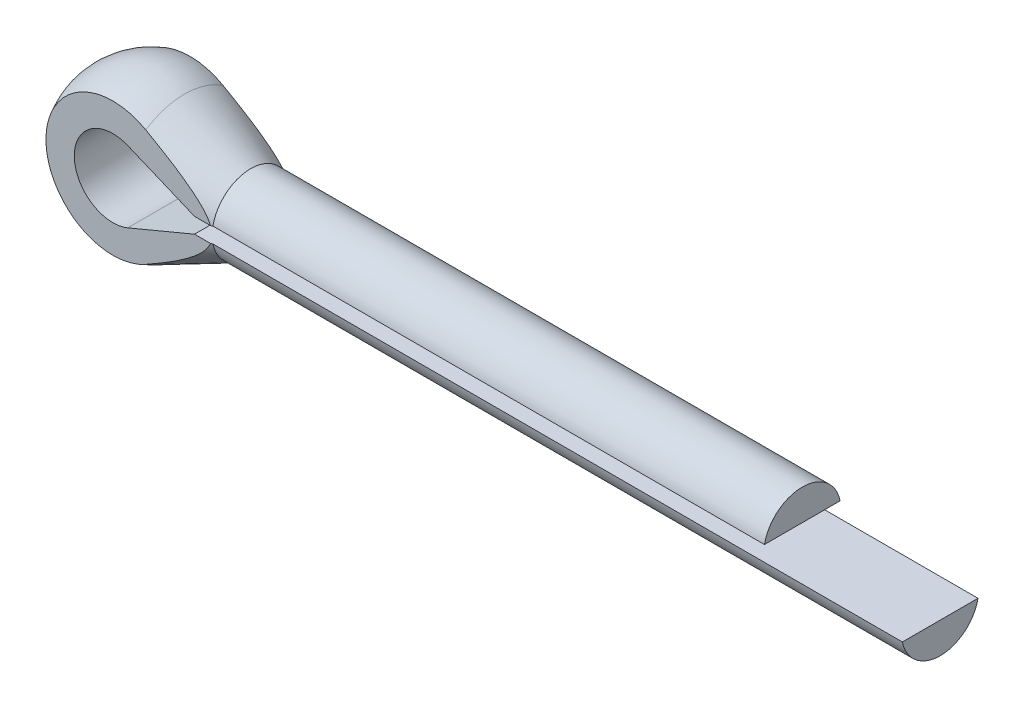
ISO-10303-21;
HEADER;
FILE_DESCRIPTION(('STEP AP214'),'2;1');
FILE_NAME('part.step','',(''),(''),'','','');
FILE_SCHEMA(('AUTOMOTIVE_DESIGN { 1 0 10303 214 1 1 1 1 }'));
ENDSEC;
DATA;
#1=APPLICATION_CONTEXT('core data for automotive mechanical design processes');
#2=APPLICATION_PROTOCOL_DEFINITION('international standard','automotive_design',2000,#1);
#3=PRODUCT_CONTEXT('',#1,'mechanical');
#4=PRODUCT('Part','Part','',(#3));
#5=PRODUCT_RELATED_PRODUCT_CATEGORY('part','',(#4));
#6=PRODUCT_DEFINITION_FORMATION('','',#4);
#7=PRODUCT_DEFINITION_CONTEXT('part definition',#1,'design');
#8=PRODUCT_DEFINITION('design','',#6,#7);
#9=PRODUCT_DEFINITION_SHAPE('','',#8);
#10=(LENGTH_UNIT() NAMED_UNIT(*) SI_UNIT(.MILLI.,.METRE.));
#11=(NAMED_UNIT(*) PLANE_ANGLE_UNIT() SI_UNIT($,.RADIAN.));
#12=(NAMED_UNIT(*) SI_UNIT($,.STERADIAN.) SOLID_ANGLE_UNIT());
#13=UNCERTAINTY_MEASURE_WITH_UNIT(LENGTH_MEASURE(1.E-05),#10,'distance_accuracy_value','');
#14=(GEOMETRIC_REPRESENTATION_CONTEXT(3) GLOBAL_UNCERTAINTY_ASSIGNED_CONTEXT((#13)) GLOBAL_UNIT_ASSIGNED_CONTEXT((#10,
#11,#12)) REPRESENTATION_CONTEXT('',''));
#15=CARTESIAN_POINT('',(0.,0.,0.));
#16=DIRECTION('',(0.,0.,1.));
#17=DIRECTION('',(1.,0.,0.));
#18=AXIS2_PLACEMENT_3D('',#15,#16,#17);
#19=CARTESIAN_POINT('',(0.,0.,0.));
#20=DIRECTION('',(-1.,0.,0.));
#21=DIRECTION('',(0.,0.,1.));
#22=AXIS2_PLACEMENT_3D('',#19,#20,#21);
#23=CYLINDRICAL_SURFACE('',#22,0.699999999999999);
#24=CARTESIAN_POINT('',(12.5,0.,0.));
#25=DIRECTION('',(-1.,0.,0.));
#26=DIRECTION('',(0.,0.,1.));
#27=AXIS2_PLACEMENT_3D('',#24,#25,#26);
#28=CIRCLE('',#27,0.7);
#29=CARTESIAN_POINT('',(12.5,-0.14,-0.68585712797929));
#30=VERTEX_POINT('',#29);
#31=CARTESIAN_POINT('',(12.5,-0.14,0.68585712797929));
#32=VERTEX_POINT('',#31);
#33=EDGE_CURVE('E289',#30,#32,#28,.T.);
#34=ORIENTED_EDGE('',*,*,#33,.T.);
#35=DIRECTION('',(-1.,0.,0.));
#36=VECTOR('',#35,1.);
#37=CARTESIAN_POINT('',(0.,-0.140000000000002,0.685857127979288));
#38=LINE('',#37,#36);
#39=CARTESIAN_POINT('',(0.,-0.140000000000002,0.685857127979288));
#40=VERTEX_POINT('',#39);
#41=EDGE_CURVE('E182',#32,#40,#38,.T.);
#42=ORIENTED_EDGE('',*,*,#41,.T.);
#43=CARTESIAN_POINT('',(0.,0.,0.));
#44=DIRECTION('',(-1.,0.,0.));
#45=DIRECTION('',(0.,0.,1.));
#46=AXIS2_PLACEMENT_3D('',#43,#44,#45);
#47=CIRCLE('',#46,0.699999999999998);
#48=CARTESIAN_POINT('',(0.,-0.140000000000002,-0.685857127979288));
#49=VERTEX_POINT('',#48);
#50=EDGE_CURVE('E273',#49,#40,#47,.T.);
#51=ORIENTED_EDGE('',*,*,#50,.F.);
#52=DIRECTION('',(-1.,0.,0.));
#53=VECTOR('',#52,1.);
#54=CARTESIAN_POINT('',(0.,-0.140000000000002,-0.685857127979288));
#55=LINE('',#54,#53);
#56=EDGE_CURVE('E203',#49,#30,#55,.F.);
#57=ORIENTED_EDGE('',*,*,#56,.T.);
#58=EDGE_LOOP('',(#34,#42,#51,#57));
#59=FACE_BOUND('',#58,.T.);
#60=ADVANCED_FACE('F33',(#59),#23,.T.);
#61=CARTESIAN_POINT('',(0.,0.,0.));
#62=DIRECTION('',(-1.,0.,0.));
#63=DIRECTION('',(0.,0.,1.));
#64=AXIS2_PLACEMENT_3D('',#61,#62,#63);
#65=CONICAL_SURFACE('',#64,0.699999999999998,0.439987070568522);
#66=CARTESIAN_POINT('',(0.,0.140000000000002,0.685857127979288));
#67=VERTEX_POINT('',#66);
#68=CARTESIAN_POINT('',(0.,0.140000000000002,-0.685857127979288));
#69=VERTEX_POINT('',#68);
#70=EDGE_CURVE('E272',#67,#69,#47,.T.);
#71=ORIENTED_EDGE('',*,*,#70,.T.);
#72=CARTESIAN_POINT('',(0.853310963179075,0.140000000000002,-0.263396460438695));
#73=CARTESIAN_POINT('',(0.822525899119238,0.140000000000002,-0.279788680141323));
#74=CARTESIAN_POINT('',(0.791620635261703,0.140000000000002,-0.295951189935721));
#75=CARTESIAN_POINT('',(0.729639374388377,0.140000000000002,-0.327942405176914));
#76=CARTESIAN_POINT('',(0.698563385476782,0.140000000000002,-0.343771126298757));
#77=CARTESIAN_POINT('',(0.605184515377583,0.140000000000002,-0.390944727574723));
#78=CARTESIAN_POINT('',(0.542725701873997,0.140000000000002,-0.4219796705003));
#79=CARTESIAN_POINT('',(0.389391532189019,0.140000000000002,-0.497534796467338));
#80=CARTESIAN_POINT('',(0.298403333688808,0.140000000000002,-0.541824890608419));
#81=CARTESIAN_POINT('',(0.116222481349827,0.140000000000002,-0.629996007773571));
#82=CARTESIAN_POINT('',(0.0250298149304939,0.140000000000002,-0.673877004719269));
#83=CARTESIAN_POINT('',(-0.220340476039346,0.140000000000002,-0.791571042883773));
#84=CARTESIAN_POINT('',(-0.374618929662074,0.140000000000002,-0.865173725878924));
#85=CARTESIAN_POINT('',(-0.606126825690749,0.140000000000002,-0.975360004321794));
#86=CARTESIAN_POINT('',(-0.683305807022772,0.140000000000002,-1.0120499369442));
#87=CARTESIAN_POINT('',(-0.837690055661798,0.140000000000002,-1.08537421722376));
#88=CARTESIAN_POINT('',(-0.914895322936407,0.140000000000002,-1.12200856494911));
#89=CARTESIAN_POINT('',(-0.992110156812102,0.140000000000002,-1.15862280539277));
#90=B_SPLINE_CURVE_WITH_KNOTS('',3,(#72,#73,#74,#75,#76,#77,#78,#79,#80,#81,#82,#83,#84,#85,#86,
#87,#88,#89),.UNSPECIFIED.,.F.,.F.,(4,2,2,2,2,2,2,2,4),(0.,0.10462823240668,0.209251540375876,
0.418481139981242,0.722064545496831,1.02566717275192,1.53847493477792,1.79484327465922,
2.05121129973774),.UNSPECIFIED.);
#91=CARTESIAN_POINT('',(-0.0294472609152982,0.140000000000002,-0.7));
#92=VERTEX_POINT('',#91);
#93=EDGE_CURVE('E223',#69,#92,#90,.T.);
#94=ORIENTED_EDGE('',*,*,#93,.T.);
#95=CARTESIAN_POINT('',(-2.3392539343471,-1.6596563624566,-0.7));
#96=CARTESIAN_POINT('',(-2.22077323185053,-1.59907537766814,-0.7));
#97=CARTESIAN_POINT('',(-2.10245523729017,-1.53816319271602,-0.7));
#98=CARTESIAN_POINT('',(-1.86633274620435,-1.41517602285627,-0.7));
#99=CARTESIAN_POINT('',(-1.74852861388846,-1.35310033983564,-0.7));
#100=CARTESIAN_POINT('',(-1.51349129285898,-1.22721073395307,-0.7));
#101=CARTESIAN_POINT('',(-1.39626012033632,-1.16339303839626,-0.7));
#102=CARTESIAN_POINT('',(-1.16319475720901,-1.03331123657181,-0.7));
#103=CARTESIAN_POINT('',(-1.04736011062749,-0.967047959174088,-0.7));
#104=CARTESIAN_POINT('',(-0.880790290468446,-0.867633137771659,-0.7));
#105=CARTESIAN_POINT('',(-0.829053895576292,-0.836163717466199,-0.7));
#106=CARTESIAN_POINT('',(-0.726296188300841,-0.772032091151096,-0.7));
#107=CARTESIAN_POINT('',(-0.67527512441279,-0.739369484190166,-0.7));
#108=CARTESIAN_POINT('',(-0.574117510086523,-0.672303251527076,-0.7));
#109=CARTESIAN_POINT('',(-0.523984869067096,-0.637893704799886,-0.7));
#110=CARTESIAN_POINT('',(-0.425407291355475,-0.566759203193984,-0.7));
#111=CARTESIAN_POINT('',(-0.376961128834906,-0.530035986984093,-0.7));
#112=CARTESIAN_POINT('',(-0.306220692721122,-0.472071779956187,-0.7));
#113=CARTESIAN_POINT('',(-0.282844018575544,-0.452157787943053,-0.7));
#114=CARTESIAN_POINT('',(-0.237138338101798,-0.411168351357972,-0.7));
#115=CARTESIAN_POINT('',(-0.214808881738535,-0.390093414320982,-0.7));
#116=CARTESIAN_POINT('',(-0.171771602008754,-0.346579843550924,-0.7));
#117=CARTESIAN_POINT('',(-0.151054914587189,-0.324150076893843,-0.7));
#118=CARTESIAN_POINT('',(-0.111871634957124,-0.277426985551496,-0.7));
#119=CARTESIAN_POINT('',(-0.0934006040849903,-0.253137496938592,-0.7));
#120=CARTESIAN_POINT('',(-0.0641602760213682,-0.208627794148942,-0.7));
#121=CARTESIAN_POINT('',(-0.0526223622406483,-0.188920702546322,-0.7));
#122=CARTESIAN_POINT('',(-0.0323350945936077,-0.14810382412629,-0.7));
#123=CARTESIAN_POINT('',(-0.0235820948202656,-0.126995915352264,-0.7));
#124=CARTESIAN_POINT('',(-0.0108725650554495,-0.0867551962831278,-0.7));
#125=CARTESIAN_POINT('',(-0.00639933342165855,-0.0677896260074821,-0.7));
#126=CARTESIAN_POINT('',(-0.000753683100295894,-0.0293701818580379,-0.7));
#127=CARTESIAN_POINT('',(0.000421509085580514,-0.00991673216872052,-0.7));
#128=CARTESIAN_POINT('',(-0.000695000649532944,0.0289040393618043,-0.7));
#129=CARTESIAN_POINT('',(-0.00298977622699907,0.0482712695858044,-0.7));
#130=CARTESIAN_POINT('',(-0.0107279934804023,0.08635288829476,-0.7));
#131=CARTESIAN_POINT('',(-0.0161734751734173,0.105066845466877,-0.7));
#132=CARTESIAN_POINT('',(-0.0329194932803495,0.150520245184951,-0.7));
#133=CARTESIAN_POINT('',(-0.0457827801037401,0.176673653698114,-0.7));
#134=CARTESIAN_POINT('',(-0.0752545747644721,0.226800132786871,-0.7));
#135=CARTESIAN_POINT('',(-0.0918784496111851,0.250763674296614,-0.7));
#136=CARTESIAN_POINT('',(-0.135368687304226,0.306982279672886,-0.7));
#137=CARTESIAN_POINT('',(-0.163516844515935,0.33822731041113,-0.7));
#138=CARTESIAN_POINT('',(-0.222610506997484,0.397987718677809,-0.7));
#139=CARTESIAN_POINT('',(-0.25356277779079,0.426496133169743,-0.7));
#140=CARTESIAN_POINT('',(-0.317572566524611,0.481869642735049,-0.7));
#141=CARTESIAN_POINT('',(-0.350651694519357,0.508709509689639,-0.7));
#142=CARTESIAN_POINT('',(-0.41791153557534,0.560861974975159,-0.7));
#143=CARTESIAN_POINT('',(-0.452090800501873,0.586176464438564,-0.7));
#144=CARTESIAN_POINT('',(-0.528164472975812,0.640641915955414,-0.7));
#145=CARTESIAN_POINT('',(-0.57023411316166,0.66954693284687,-0.7));
#146=CARTESIAN_POINT('',(-0.655165510873793,0.726173123022078,-0.7));
#147=CARTESIAN_POINT('',(-0.698027386311101,0.753894118017749,-0.7));
#148=CARTESIAN_POINT('',(-0.827498171396349,0.835748275883986,-0.7));
#149=CARTESIAN_POINT('',(-0.914950473587916,0.888543729275957,-0.7));
#150=CARTESIAN_POINT('',(-1.09137192196368,0.99206986446486,-0.7));
#151=CARTESIAN_POINT('',(-1.18034456179688,1.04279450590379,-0.7));
#152=CARTESIAN_POINT('',(-1.35909888724152,1.14273028033277,-0.7));
#153=CARTESIAN_POINT('',(-1.44888032132435,1.19194186419831,-0.7));
#154=CARTESIAN_POINT('',(-1.61863233483489,1.28369563805276,-0.7));
#155=CARTESIAN_POINT('',(-1.69854104383141,1.32635280088628,-0.7));
#156=CARTESIAN_POINT('',(-1.85870001452922,1.41103838346326,-0.7));
#157=CARTESIAN_POINT('',(-1.93895030687508,1.4530667451998,-0.7));
#158=CARTESIAN_POINT('',(-2.09930689358688,1.5364243495924,-0.7));
#159=CARTESIAN_POINT('',(-2.17941192419353,1.5777560275145,-0.7));
#160=CARTESIAN_POINT('',(-2.33981441530564,1.66002137088132,-0.7));
#161=CARTESIAN_POINT('',(-2.42011185231833,1.70095508211047,-0.7));
#162=CARTESIAN_POINT('',(-2.50048474140025,1.74173898510037,-0.7));
#163=B_SPLINE_CURVE_WITH_KNOTS('',3,(#95,#96,#97,#98,#99,#100,#101,#102,#103,#104,#105,#106,
#107,#108,#109,#110,#111,#112,#113,#114,#115,#116,#117,#118,#119,#120,#121,#122,#123,#124,#125,
#126,#127,#128,#129,#130,#131,#132,#133,#134,#135,#136,#137,#138,#139,#140,#141,#142,#143,#144,
#145,#146,#147,#148,#149,#150,#151,#152,#153,#154,#155,#156,#157,#158,#159,#160,#161,#162),
.UNSPECIFIED.,.F.,.F.,(4,2,2,2,2,2,2,2,2,2,2,2,2,2,2,2,2,2,2,2,2,2,2,2,2,2,2,2,2,2,2,2,2,4),(0.,
0.399220193217245,0.798688120214247,1.19910326739346,1.59938392797924,1.78104011091936,
1.96275790840259,2.14513915171788,2.32738493780433,2.41948375809581,2.51154262987459,
2.60305335366036,2.69438015483891,2.76273624497353,2.83100247405153,2.88921007001435,
2.94736870139764,3.00557887919647,3.06382678912664,3.15075842691154,3.23805192723083,
3.36388355973968,3.49002731258707,3.61776027899888,3.74533148049241,3.89843030598109,
4.05155210414781,4.35794789999655,4.66518146518398,4.97232257271905,5.24406442820676,
5.51583119921537,5.78624846454917,6.05663424232048),.UNSPECIFIED.);
#164=CARTESIAN_POINT('',(-1.20370112605193,1.055664555116,-0.7));
#165=VERTEX_POINT('',#164);
#166=EDGE_CURVE('E235',#92,#165,#163,.T.);
#167=ORIENTED_EDGE('',*,*,#166,.T.);
#168=CARTESIAN_POINT('',(-1.20370112605193,0.,0.));
#169=DIRECTION('',(-1.,0.,0.));
#170=DIRECTION('',(0.,0.,1.));
#171=AXIS2_PLACEMENT_3D('',#168,#169,#170);
#172=CIRCLE('',#171,1.26666003841925);
#173=CARTESIAN_POINT('',(-1.20370112605193,1.055664555116,0.7));
#174=VERTEX_POINT('',#173);
#175=EDGE_CURVE('E277',#174,#165,#172,.T.);
#176=ORIENTED_EDGE('',*,*,#175,.F.);
#177=CARTESIAN_POINT('',(-2.3392539343471,-1.6596563624566,0.7));
#178=CARTESIAN_POINT('',(-2.22077323185053,-1.59907537766814,0.7));
#179=CARTESIAN_POINT('',(-2.10245523729017,-1.53816319271602,0.7));
#180=CARTESIAN_POINT('',(-1.86633274620435,-1.41517602285627,0.7));
#181=CARTESIAN_POINT('',(-1.74852861388846,-1.35310033983564,0.7));
#182=CARTESIAN_POINT('',(-1.51349129285898,-1.22721073395307,0.7));
#183=CARTESIAN_POINT('',(-1.39626012033632,-1.16339303839626,0.7));
#184=CARTESIAN_POINT('',(-1.16319475720901,-1.03331123657181,0.7));
#185=CARTESIAN_POINT('',(-1.0473601106275,-0.967047959174088,0.7));
#186=CARTESIAN_POINT('',(-0.880790290468447,-0.867633137771659,0.7));
#187=CARTESIAN_POINT('',(-0.829053895576292,-0.836163717466199,0.7));
#188=CARTESIAN_POINT('',(-0.726296188300841,-0.772032091151096,0.7));
#189=CARTESIAN_POINT('',(-0.67527512441279,-0.739369484190166,0.7));
#190=CARTESIAN_POINT('',(-0.574117510086523,-0.672303251527076,0.7));
#191=CARTESIAN_POINT('',(-0.523984869067096,-0.637893704799885,0.7));
#192=CARTESIAN_POINT('',(-0.425407291355474,-0.566759203193983,0.7));
#193=CARTESIAN_POINT('',(-0.376961128834905,-0.530035986984093,0.7));
#194=CARTESIAN_POINT('',(-0.306220692721121,-0.472071779956186,0.7));
#195=CARTESIAN_POINT('',(-0.282844018575544,-0.452157787943053,0.7));
#196=CARTESIAN_POINT('',(-0.237138338101798,-0.411168351357972,0.7));
#197=CARTESIAN_POINT('',(-0.214808881738535,-0.390093414320982,0.7));
#198=CARTESIAN_POINT('',(-0.171771602008754,-0.346579843550924,0.7));
#199=CARTESIAN_POINT('',(-0.151054914587188,-0.324150076893842,0.7));
#200=CARTESIAN_POINT('',(-0.111871634957124,-0.277426985551496,0.7));
#201=CARTESIAN_POINT('',(-0.0934006040849899,-0.253137496938592,0.7));
#202=CARTESIAN_POINT('',(-0.0641602760213678,-0.208627794148942,0.7));
#203=CARTESIAN_POINT('',(-0.052622362240648,-0.188920702546321,0.7));
#204=CARTESIAN_POINT('',(-0.0323350945936075,-0.148103824126289,0.7));
#205=CARTESIAN_POINT('',(-0.0235820948202653,-0.126995915352264,0.7));
#206=CARTESIAN_POINT('',(-0.0108725650554493,-0.0867551962831271,0.7));
#207=CARTESIAN_POINT('',(-0.0063993334216585,-0.0677896260074814,0.7));
#208=CARTESIAN_POINT('',(-0.000753683100295937,-0.0293701818580372,0.7));
#209=CARTESIAN_POINT('',(0.000421509085580504,-0.00991673216871991,0.7));
#210=CARTESIAN_POINT('',(-0.000695000649532932,0.0289040393618048,0.7));
#211=CARTESIAN_POINT('',(-0.00298977622699906,0.0482712695858049,0.7));
#212=CARTESIAN_POINT('',(-0.0107279934804024,0.0863528882947604,0.7));
#213=CARTESIAN_POINT('',(-0.0161734751734175,0.105066845466877,0.7));
#214=CARTESIAN_POINT('',(-0.0329194932803498,0.150520245184951,0.7));
#215=CARTESIAN_POINT('',(-0.0457827801037405,0.176673653698115,0.7));
#216=CARTESIAN_POINT('',(-0.0752545747644725,0.226800132786872,0.7));
#217=CARTESIAN_POINT('',(-0.0918784496111854,0.250763674296615,0.7));
#218=CARTESIAN_POINT('',(-0.135368687304227,0.306982279672887,0.7));
#219=CARTESIAN_POINT('',(-0.163516844515936,0.338227310411131,0.7));
#220=CARTESIAN_POINT('',(-0.222610506997485,0.39798771867781,0.7));
#221=CARTESIAN_POINT('',(-0.253562777790791,0.426496133169744,0.7));
#222=CARTESIAN_POINT('',(-0.317572566524612,0.48186964273505,0.7));
#223=CARTESIAN_POINT('',(-0.350651694519359,0.50870950968964,0.7));
#224=CARTESIAN_POINT('',(-0.417911535575342,0.56086197497516,0.7));
#225=CARTESIAN_POINT('',(-0.452090800501875,0.586176464438565,0.7));
#226=CARTESIAN_POINT('',(-0.528164472975814,0.640641915955415,0.7));
#227=CARTESIAN_POINT('',(-0.570234113161663,0.669546932846871,0.7));
#228=CARTESIAN_POINT('',(-0.655165510873796,0.72617312302208,0.7));
#229=CARTESIAN_POINT('',(-0.698027386311104,0.753894118017751,0.7));
#230=CARTESIAN_POINT('',(-0.827498171396353,0.835748275883988,0.7));
#231=CARTESIAN_POINT('',(-0.91495047358792,0.88854372927596,0.7));
#232=CARTESIAN_POINT('',(-1.09137192196369,0.992069864464862,0.7));
#233=CARTESIAN_POINT('',(-1.18034456179689,1.0427945059038,0.7));
#234=CARTESIAN_POINT('',(-1.35909888724153,1.14273028033278,0.7));
#235=CARTESIAN_POINT('',(-1.44888032132436,1.19194186419831,0.7));
#236=CARTESIAN_POINT('',(-1.61863233483489,1.28369563805276,0.7));
#237=CARTESIAN_POINT('',(-1.69854104383142,1.32635280088628,0.7));
#238=CARTESIAN_POINT('',(-1.85870001452923,1.41103838346327,0.7));
#239=CARTESIAN_POINT('',(-1.93895030687509,1.4530667451998,0.7));
#240=CARTESIAN_POINT('',(-2.09930689358689,1.5364243495924,0.7));
#241=CARTESIAN_POINT('',(-2.17941192419354,1.5777560275145,0.7));
#242=CARTESIAN_POINT('',(-2.33981441530565,1.66002137088132,0.7));
#243=CARTESIAN_POINT('',(-2.42011185231834,1.70095508211048,0.7));
#244=CARTESIAN_POINT('',(-2.50048474140026,1.74173898510038,0.7));
#245=B_SPLINE_CURVE_WITH_KNOTS('',3,(#177,#178,#179,#180,#181,#182,#183,#184,#185,#186,#187,
#188,#189,#190,#191,#192,#193,#194,#195,#196,#197,#198,#199,#200,#201,#202,#203,#204,#205,#206,
#207,#208,#209,#210,#211,#212,#213,#214,#215,#216,#217,#218,#219,#220,#221,#222,#223,#224,#225,
#226,#227,#228,#229,#230,#231,#232,#233,#234,#235,#236,#237,#238,#239,#240,#241,#242,#243,#244),
.UNSPECIFIED.,.F.,.F.,(4,2,2,2,2,2,2,2,2,2,2,2,2,2,2,2,2,2,2,2,2,2,2,2,2,2,2,2,2,2,2,2,2,4),(0.,
0.399220193217245,0.798688120214247,1.19910326739346,1.59938392797924,1.78104011091936,
1.96275790840259,2.14513915171788,2.32738493780433,2.41948375809581,2.51154262987459,
2.60305335366036,2.69438015483891,2.76273624497353,2.83100247405153,2.88921007001435,
2.94736870139764,3.00557887919647,3.06382678912664,3.15075842691154,3.23805192723083,
3.36388355973968,3.49002731258707,3.61776027899888,3.74533148049242,3.89843030598109,
4.05155210414781,4.35794789999655,4.66518146518399,4.97232257271906,5.24406442820677,
5.51583119921538,5.78624846454918,6.0566342423205),.UNSPECIFIED.);
#246=CARTESIAN_POINT('',(-0.0294472609156365,0.140000000000002,0.700000000000001));
#247=VERTEX_POINT('',#246);
#248=EDGE_CURVE('E234',#174,#247,#245,.F.);
#249=ORIENTED_EDGE('',*,*,#248,.T.);
#250=CARTESIAN_POINT('',(-0.992110156812103,0.140000000000002,1.15862280539277));
#251=CARTESIAN_POINT('',(-0.914888200218984,0.140000000000002,1.12200341047905));
#252=CARTESIAN_POINT('',(-0.837674739346088,0.140000000000002,1.08536606111641));
#253=CARTESIAN_POINT('',(-0.683274952837422,0.140000000000002,1.01203616478215));
#254=CARTESIAN_POINT('',(-0.606088626945895,0.140000000000002,0.975343618348976));
#255=CARTESIAN_POINT('',(-0.451755824495786,0.140000000000002,0.901885266132986));
#256=CARTESIAN_POINT('',(-0.374609346051161,0.140000000000002,0.865119464313698));
#257=CARTESIAN_POINT('',(-0.220367668303544,0.140000000000002,0.791478405992393));
#258=CARTESIAN_POINT('',(-0.143272469519479,0.140000000000002,0.754603148402754));
#259=CARTESIAN_POINT('',(0.0108448418093808,0.140000000000002,0.680682494169105));
#260=CARTESIAN_POINT('',(0.0878669471862071,0.140000000000002,0.643637082575719));
#261=CARTESIAN_POINT('',(0.241779502845366,0.140000000000002,0.569277625824521));
#262=CARTESIAN_POINT('',(0.318669956149208,0.140000000000002,0.531963586937032));
#263=CARTESIAN_POINT('',(0.433827355196682,0.140000000000002,0.475618584642819));
#264=CARTESIAN_POINT('',(0.472185226514387,0.140000000000002,0.456773705437585));
#265=CARTESIAN_POINT('',(0.548810018115636,0.140000000000002,0.418901510229994));
#266=CARTESIAN_POINT('',(0.58707693985284,0.140000000000002,0.399874197168307));
#267=CARTESIAN_POINT('',(0.663483461282811,0.140000000000002,0.361555821158966));
#268=CARTESIAN_POINT('',(0.701623049738178,0.140000000000002,0.342264735660439));
#269=CARTESIAN_POINT('',(0.777668849124648,0.140000000000002,0.303223555245704));
#270=CARTESIAN_POINT('',(0.81557504644968,0.140000000000002,0.2834734338835));
#271=CARTESIAN_POINT('',(0.853310963179075,0.140000000000002,0.263396460438695));
#272=B_SPLINE_CURVE_WITH_KNOTS('',3,(#250,#251,#252,#253,#254,#255,#256,#257,#258,#259,#260,
#261,#262,#263,#264,#265,#266,#267,#268,#269,#270,#271),.UNSPECIFIED.,.F.,.F.,(4,2,2,2,2,2,2,2,
2,2,4),(0.,0.256394048357573,0.512785611580961,0.769163660126547,1.02554426479158,
1.28194784266031,1.53834545481513,1.66655622274076,1.79476492748686,1.92298466266465,
2.05121180324468),.UNSPECIFIED.);
#273=EDGE_CURVE('E209',#247,#67,#272,.T.);
#274=ORIENTED_EDGE('',*,*,#273,.T.);
#275=EDGE_LOOP('',(#71,#94,#167,#176,#249,#274));
#276=FACE_BOUND('',#275,.T.);
#277=ADVANCED_FACE('F257',(#276),#65,.T.);
#278=ORIENTED_EDGE('',*,*,#70,.F.);
#279=DIRECTION('',(-1.,0.,0.));
#280=VECTOR('',#279,1.);
#281=CARTESIAN_POINT('',(0.,0.140000000000002,0.685857127979288));
#282=LINE('',#281,#280);
#283=CARTESIAN_POINT('',(10.,0.140000000000001,0.685857127979289));
#284=VERTEX_POINT('',#283);
#285=EDGE_CURVE('E206',#67,#284,#282,.F.);
#286=ORIENTED_EDGE('',*,*,#285,.T.);
#287=CARTESIAN_POINT('',(10.,0.,0.));
#288=DIRECTION('',(-1.,0.,0.));
#289=DIRECTION('',(0.,0.,1.));
#290=AXIS2_PLACEMENT_3D('',#287,#288,#289);
#291=CIRCLE('',#290,0.699999999999999);
#292=CARTESIAN_POINT('',(10.,0.140000000000001,-0.685857127979289));
#293=VERTEX_POINT('',#292);
#294=EDGE_CURVE('E11',#284,#293,#291,.T.);
#295=ORIENTED_EDGE('',*,*,#294,.T.);
#296=DIRECTION('',(-1.,0.,0.));
#297=VECTOR('',#296,1.);
#298=CARTESIAN_POINT('',(0.,0.140000000000002,-0.685857127979288));
#299=LINE('',#298,#297);
#300=EDGE_CURVE('E215',#293,#69,#299,.T.);
#301=ORIENTED_EDGE('',*,*,#300,.T.);
#302=EDGE_LOOP('',(#278,#286,#295,#301));
#303=FACE_BOUND('',#302,.T.);
#304=ADVANCED_FACE('F35',(#303),#23,.T.);
#305=CARTESIAN_POINT('',(-1.20370112605193,-1.055664555116,-0.7));
#306=VERTEX_POINT('',#305);
#307=CARTESIAN_POINT('',(-0.0294472609156209,-0.140000000000002,-0.7));
#308=VERTEX_POINT('',#307);
#309=EDGE_CURVE('E286',#306,#308,#163,.T.);
#310=ORIENTED_EDGE('',*,*,#309,.T.);
#311=CARTESIAN_POINT('',(-0.992110156812102,-0.140000000000002,-1.15862280539277));
#312=CARTESIAN_POINT('',(-0.914888200218983,-0.140000000000002,-1.12200341047905));
#313=CARTESIAN_POINT('',(-0.837674739346087,-0.140000000000002,-1.08536606111641));
#314=CARTESIAN_POINT('',(-0.683274952837422,-0.140000000000002,-1.01203616478215));
#315=CARTESIAN_POINT('',(-0.606088626945895,-0.140000000000002,-0.975343618348975));
#316=CARTESIAN_POINT('',(-0.451755824495786,-0.140000000000002,-0.901885266132986));
#317=CARTESIAN_POINT('',(-0.374609346051161,-0.140000000000002,-0.865119464313698));
#318=CARTESIAN_POINT('',(-0.220367668303543,-0.140000000000002,-0.791478405992393));
#319=CARTESIAN_POINT('',(-0.143272469519479,-0.140000000000002,-0.754603148402754));
#320=CARTESIAN_POINT('',(0.0108448418093811,-0.140000000000002,-0.680682494169105));
#321=CARTESIAN_POINT('',(0.0878669471862074,-0.140000000000002,-0.643637082575719));
#322=CARTESIAN_POINT('',(0.241779502845366,-0.140000000000002,-0.569277625824521));
#323=CARTESIAN_POINT('',(0.318669956149208,-0.140000000000002,-0.531963586937032));
#324=CARTESIAN_POINT('',(0.433827355196682,-0.140000000000002,-0.475618584642819));
#325=CARTESIAN_POINT('',(0.472185226514387,-0.140000000000002,-0.456773705437585));
#326=CARTESIAN_POINT('',(0.548810018115636,-0.140000000000002,-0.418901510229994));
#327=CARTESIAN_POINT('',(0.58707693985284,-0.140000000000002,-0.399874197168307));
#328=CARTESIAN_POINT('',(0.663483461282811,-0.140000000000002,-0.361555821158966));
#329=CARTESIAN_POINT('',(0.701623049738178,-0.140000000000002,-0.342264735660439));
#330=CARTESIAN_POINT('',(0.777668849124648,-0.140000000000002,-0.303223555245704));
#331=CARTESIAN_POINT('',(0.81557504644968,-0.140000000000002,-0.2834734338835));
#332=CARTESIAN_POINT('',(0.853310963179075,-0.140000000000002,-0.263396460438695));
#333=B_SPLINE_CURVE_WITH_KNOTS('',3,(#311,#312,#313,#314,#315,#316,#317,#318,#319,#320,#321,
#322,#323,#324,#325,#326,#327,#328,#329,#330,#331,#332),.UNSPECIFIED.,.F.,.F.,(4,2,2,2,2,2,2,2,
2,2,4),(0.,0.256394048357573,0.512785611580961,0.769163660126547,1.02554426479158,
1.2819478426603,1.53834545481513,1.66655622274076,1.79476492748686,1.92298466266465,
2.05121180324468),.UNSPECIFIED.);
#334=EDGE_CURVE('E197',#308,#49,#333,.T.);
#335=ORIENTED_EDGE('',*,*,#334,.T.);
#336=ORIENTED_EDGE('',*,*,#50,.T.);
#337=CARTESIAN_POINT('',(0.853310963179075,-0.140000000000002,0.263396460438695));
#338=CARTESIAN_POINT('',(0.822525899119238,-0.140000000000002,0.279788680141323));
#339=CARTESIAN_POINT('',(0.791620635261703,-0.140000000000002,0.295951189935721));
#340=CARTESIAN_POINT('',(0.729639374388377,-0.140000000000002,0.327942405176914));
#341=CARTESIAN_POINT('',(0.698563385476782,-0.140000000000002,0.343771126298757));
#342=CARTESIAN_POINT('',(0.605184515377583,-0.140000000000002,0.390944727574723));
#343=CARTESIAN_POINT('',(0.542725701873997,-0.140000000000002,0.4219796705003));
#344=CARTESIAN_POINT('',(0.389391532189019,-0.140000000000002,0.497534796467338));
#345=CARTESIAN_POINT('',(0.298403333688808,-0.140000000000002,0.541824890608419));
#346=CARTESIAN_POINT('',(0.116222481349827,-0.140000000000002,0.629996007773571));
#347=CARTESIAN_POINT('',(0.0250298149304938,-0.140000000000002,0.673877004719269));
#348=CARTESIAN_POINT('',(-0.220340476039347,-0.140000000000002,0.791571042883773));
#349=CARTESIAN_POINT('',(-0.374618929662075,-0.140000000000002,0.865173725878924));
#350=CARTESIAN_POINT('',(-0.606126825690749,-0.140000000000002,0.975360004321795));
#351=CARTESIAN_POINT('',(-0.683305807022772,-0.140000000000002,1.0120499369442));
#352=CARTESIAN_POINT('',(-0.837690055661799,-0.140000000000002,1.08537421722376));
#353=CARTESIAN_POINT('',(-0.914895322936408,-0.140000000000002,1.12200856494911));
#354=CARTESIAN_POINT('',(-0.992110156812103,-0.140000000000002,1.15862280539277));
#355=B_SPLINE_CURVE_WITH_KNOTS('',3,(#337,#338,#339,#340,#341,#342,#343,#344,#345,#346,#347,
#348,#349,#350,#351,#352,#353,#354),.UNSPECIFIED.,.F.,.F.,(4,2,2,2,2,2,2,2,4),(0.,
0.10462823240668,0.209251540375875,0.418481139981242,0.722064545496831,1.02566717275192,
1.53847493477792,1.79484327465922,2.05121129973774),.UNSPECIFIED.);
#356=CARTESIAN_POINT('',(-0.0294472609156209,-0.140000000000002,0.700000000000001));
#357=VERTEX_POINT('',#356);
#358=EDGE_CURVE('E167',#40,#357,#355,.T.);
#359=ORIENTED_EDGE('',*,*,#358,.T.);
#360=CARTESIAN_POINT('',(-1.20370112605193,-1.055664555116,0.7));
#361=VERTEX_POINT('',#360);
#362=EDGE_CURVE('E146',#357,#361,#245,.F.);
#363=ORIENTED_EDGE('',*,*,#362,.T.);
#364=EDGE_CURVE('E274',#306,#361,#172,.T.);
#365=ORIENTED_EDGE('',*,*,#364,.F.);
#366=EDGE_LOOP('',(#310,#335,#336,#359,#363,#365));
#367=FACE_BOUND('',#366,.T.);
#368=ADVANCED_FACE('F184',(#367),#65,.T.);
#369=CARTESIAN_POINT('',(-1.8,0.,0.));
#370=DIRECTION('',(-1.,0.,0.));
#371=DIRECTION('',(0.,1.,0.));
#372=AXIS2_PLACEMENT_3D('',#369,#370,#371);
#373=SPHERICAL_SURFACE('',#372,1.4);
#374=CARTESIAN_POINT('',(-1.8,0.,0.7));
#375=DIRECTION('',(0.,0.,-1.));
#376=DIRECTION('',(-1.,0.,0.));
#377=AXIS2_PLACEMENT_3D('',#374,#375,#376);
#378=CIRCLE('',#377,1.21243556529821);
#379=EDGE_CURVE('E281',#361,#174,#378,.T.);
#380=ORIENTED_EDGE('',*,*,#379,.T.);
#381=ORIENTED_EDGE('',*,*,#175,.T.);
#382=CARTESIAN_POINT('',(-1.8,0.,-0.7));
#383=DIRECTION('',(0.,0.,1.));
#384=DIRECTION('',(1.,0.,0.));
#385=AXIS2_PLACEMENT_3D('',#382,#383,#384);
#386=CIRCLE('',#385,1.21243556529821);
#387=EDGE_CURVE('E56',#165,#306,#386,.T.);
#388=ORIENTED_EDGE('',*,*,#387,.T.);
#389=ORIENTED_EDGE('',*,*,#364,.T.);
#390=EDGE_LOOP('',(#380,#381,#388,#389));
#391=FACE_BOUND('',#390,.T.);
#392=ADVANCED_FACE('F250',(#391),#373,.T.);
#393=CARTESIAN_POINT('',(12.5,0.,0.));
#394=DIRECTION('',(-1.,0.,0.));
#395=DIRECTION('',(0.,0.,1.));
#396=AXIS2_PLACEMENT_3D('',#393,#394,#395);
#397=PLANE('',#396);
#398=ORIENTED_EDGE('',*,*,#33,.F.);
#399=DIRECTION('',(0.,0.,1.));
#400=VECTOR('',#399,1.);
#401=CARTESIAN_POINT('',(12.5,-0.14,-0.7));
#402=LINE('',#401,#400);
#403=EDGE_CURVE('E134',#30,#32,#402,.T.);
#404=ORIENTED_EDGE('',*,*,#403,.T.);
#405=EDGE_LOOP('',(#398,#404));
#406=FACE_BOUND('',#405,.T.);
#407=ADVANCED_FACE('F247',(#406),#397,.F.);
#408=CARTESIAN_POINT('',(-3.01243556529821,-1.4,-0.7));
#409=DIRECTION('',(0.,0.,1.));
#410=DIRECTION('',(1.,0.,0.));
#411=AXIS2_PLACEMENT_3D('',#408,#409,#410);
#412=PLANE('',#411);
#413=ORIENTED_EDGE('',*,*,#166,.F.);
#414=DIRECTION('',(-1.,0.,0.));
#415=VECTOR('',#414,1.);
#416=CARTESIAN_POINT('',(10.,0.140000000000001,-0.7));
#417=LINE('',#416,#415);
#418=CARTESIAN_POINT('',(-0.320000000000001,0.140000000000002,-0.7));
#419=VERTEX_POINT('',#418);
#420=EDGE_CURVE('E159',#92,#419,#417,.T.);
#421=ORIENTED_EDGE('',*,*,#420,.T.);
#422=DIRECTION('',(-0.922625250313753,0.385697611456806,0.));
#423=VECTOR('',#422,1.);
#424=CARTESIAN_POINT('',(-1.53001167198024,0.645837675219626,-0.7));
#425=LINE('',#424,#423);
#426=CARTESIAN_POINT('',(-1.53001167198024,0.645837675219626,-0.7));
#427=VERTEX_POINT('',#426);
#428=EDGE_CURVE('E162',#419,#427,#425,.T.);
#429=ORIENTED_EDGE('',*,*,#428,.T.);
#430=CARTESIAN_POINT('',(-1.8,0.,-0.7));
#431=DIRECTION('',(0.,0.,1.));
#432=DIRECTION('',(1.,0.,0.));
#433=AXIS2_PLACEMENT_3D('',#430,#431,#432);
#434=CIRCLE('',#433,0.699999999999999);
#435=CARTESIAN_POINT('',(-1.53001167198024,-0.645837675219626,-0.7));
#436=VERTEX_POINT('',#435);
#437=EDGE_CURVE('E150',#427,#436,#434,.T.);
#438=ORIENTED_EDGE('',*,*,#437,.T.);
#439=DIRECTION('',(0.922625250313753,0.385697611456806,0.));
#440=VECTOR('',#439,1.);
#441=CARTESIAN_POINT('',(-0.320000000000001,-0.140000000000002,-0.7));
#442=LINE('',#441,#440);
#443=CARTESIAN_POINT('',(-0.320000000000001,-0.140000000000002,-0.7));
#444=VERTEX_POINT('',#443);
#445=EDGE_CURVE('E156',#436,#444,#442,.T.);
#446=ORIENTED_EDGE('',*,*,#445,.T.);
#447=DIRECTION('',(1.,0.,0.));
#448=VECTOR('',#447,1.);
#449=CARTESIAN_POINT('',(12.5,-0.14,-0.7));
#450=LINE('',#449,#448);
#451=EDGE_CURVE('E130',#444,#308,#450,.T.);
#452=ORIENTED_EDGE('',*,*,#451,.T.);
#453=ORIENTED_EDGE('',*,*,#309,.F.);
#454=ORIENTED_EDGE('',*,*,#387,.F.);
#455=EDGE_LOOP('',(#413,#421,#429,#438,#446,#452,#453,#454));
#456=FACE_BOUND('',#455,.T.);
#457=ADVANCED_FACE('F243',(#456),#412,.F.);
#458=CARTESIAN_POINT('',(-3.01243556529821,-1.4,0.700000000000001));
#459=DIRECTION('',(0.,0.,-1.));
#460=DIRECTION('',(-1.,0.,0.));
#461=AXIS2_PLACEMENT_3D('',#458,#459,#460);
#462=PLANE('',#461);
#463=DIRECTION('',(-0.922625250313753,0.385697611456806,0.));
#464=VECTOR('',#463,1.);
#465=CARTESIAN_POINT('',(-1.53001167198024,0.645837675219626,0.700000000000001));
#466=LINE('',#465,#464);
#467=CARTESIAN_POINT('',(-0.320000000000001,0.140000000000002,0.700000000000001));
#468=VERTEX_POINT('',#467);
#469=CARTESIAN_POINT('',(-1.53001167198024,0.645837675219626,0.700000000000001));
#470=VERTEX_POINT('',#469);
#471=EDGE_CURVE('E147',#468,#470,#466,.T.);
#472=ORIENTED_EDGE('',*,*,#471,.F.);
#473=DIRECTION('',(1.,0.,0.));
#474=VECTOR('',#473,1.);
#475=CARTESIAN_POINT('',(-3.01243556529821,0.140000000000002,0.700000000000001));
#476=LINE('',#475,#474);
#477=EDGE_CURVE('E41',#468,#247,#476,.T.);
#478=ORIENTED_EDGE('',*,*,#477,.T.);
#479=ORIENTED_EDGE('',*,*,#248,.F.);
#480=ORIENTED_EDGE('',*,*,#379,.F.);
#481=ORIENTED_EDGE('',*,*,#362,.F.);
#482=DIRECTION('',(1.,0.,0.));
#483=VECTOR('',#482,1.);
#484=CARTESIAN_POINT('',(12.5,-0.14,0.700000000000001));
#485=LINE('',#484,#483);
#486=CARTESIAN_POINT('',(-0.320000000000001,-0.140000000000002,0.700000000000001));
#487=VERTEX_POINT('',#486);
#488=EDGE_CURVE('E127',#487,#357,#485,.T.);
#489=ORIENTED_EDGE('',*,*,#488,.F.);
#490=DIRECTION('',(0.922625250313753,0.385697611456806,0.));
#491=VECTOR('',#490,1.);
#492=CARTESIAN_POINT('',(-0.320000000000001,-0.140000000000002,0.700000000000001));
#493=LINE('',#492,#491);
#494=CARTESIAN_POINT('',(-1.53001167198024,-0.645837675219626,0.7));
#495=VERTEX_POINT('',#494);
#496=EDGE_CURVE('E138',#495,#487,#493,.T.);
#497=ORIENTED_EDGE('',*,*,#496,.F.);
#498=CARTESIAN_POINT('',(-1.8,0.,0.700000000000001));
#499=DIRECTION('',(0.,0.,1.));
#500=DIRECTION('',(1.,0.,0.));
#501=AXIS2_PLACEMENT_3D('',#498,#499,#500);
#502=CIRCLE('',#501,0.699999999999999);
#503=EDGE_CURVE('E48',#470,#495,#502,.T.);
#504=ORIENTED_EDGE('',*,*,#503,.F.);
#505=EDGE_LOOP('',(#472,#478,#479,#480,#481,#489,#497,#504));
#506=FACE_BOUND('',#505,.T.);
#507=ADVANCED_FACE('F144',(#506),#462,.F.);
#508=CARTESIAN_POINT('',(10.,0.140000000000001,-0.7));
#509=DIRECTION('',(-1.,0.,0.));
#510=DIRECTION('',(0.,0.,1.));
#511=AXIS2_PLACEMENT_3D('',#508,#509,#510);
#512=PLANE('',#511);
#513=DIRECTION('',(0.,0.,1.));
#514=VECTOR('',#513,1.);
#515=CARTESIAN_POINT('',(10.,0.140000000000001,-0.7));
#516=LINE('',#515,#514);
#517=EDGE_CURVE('E171',#293,#284,#516,.T.);
#518=ORIENTED_EDGE('',*,*,#517,.F.);
#519=ORIENTED_EDGE('',*,*,#294,.F.);
#520=EDGE_LOOP('',(#518,#519));
#521=FACE_BOUND('',#520,.T.);
#522=ADVANCED_FACE('F193',(#521),#512,.F.);
#523=CARTESIAN_POINT('',(10.,0.140000000000001,-0.7));
#524=DIRECTION('',(0.,1.,0.));
#525=DIRECTION('',(-1.,0.,0.));
#526=AXIS2_PLACEMENT_3D('',#523,#524,#525);
#527=PLANE('',#526);
#528=ORIENTED_EDGE('',*,*,#300,.F.);
#529=ORIENTED_EDGE('',*,*,#517,.T.);
#530=ORIENTED_EDGE('',*,*,#285,.F.);
#531=ORIENTED_EDGE('',*,*,#273,.F.);
#532=ORIENTED_EDGE('',*,*,#477,.F.);
#533=DIRECTION('',(0.,0.,1.));
#534=VECTOR('',#533,1.);
#535=CARTESIAN_POINT('',(-0.320000000000001,0.140000000000002,-0.7));
#536=LINE('',#535,#534);
#537=EDGE_CURVE('E168',#419,#468,#536,.T.);
#538=ORIENTED_EDGE('',*,*,#537,.F.);
#539=ORIENTED_EDGE('',*,*,#420,.F.);
#540=ORIENTED_EDGE('',*,*,#93,.F.);
#541=EDGE_LOOP('',(#528,#529,#530,#531,#532,#538,#539,#540));
#542=FACE_BOUND('',#541,.T.);
#543=ADVANCED_FACE('F192',(#542),#527,.F.);
#544=CARTESIAN_POINT('',(12.5,-0.14,-0.7));
#545=DIRECTION('',(0.,-1.,0.));
#546=DIRECTION('',(1.,0.,0.));
#547=AXIS2_PLACEMENT_3D('',#544,#545,#546);
#548=PLANE('',#547);
#549=ORIENTED_EDGE('',*,*,#334,.F.);
#550=ORIENTED_EDGE('',*,*,#451,.F.);
#551=DIRECTION('',(0.,0.,1.));
#552=VECTOR('',#551,1.);
#553=CARTESIAN_POINT('',(-0.320000000000001,-0.140000000000002,-0.7));
#554=LINE('',#553,#552);
#555=EDGE_CURVE('E123',#444,#487,#554,.T.);
#556=ORIENTED_EDGE('',*,*,#555,.T.);
#557=ORIENTED_EDGE('',*,*,#488,.T.);
#558=ORIENTED_EDGE('',*,*,#358,.F.);
#559=ORIENTED_EDGE('',*,*,#41,.F.);
#560=ORIENTED_EDGE('',*,*,#403,.F.);
#561=ORIENTED_EDGE('',*,*,#56,.F.);
#562=EDGE_LOOP('',(#549,#550,#556,#557,#558,#559,#560,#561));
#563=FACE_BOUND('',#562,.T.);
#564=ADVANCED_FACE('F125',(#563),#548,.F.);
#565=CARTESIAN_POINT('',(-1.8,0.,-0.7));
#566=DIRECTION('',(0.,0.,1.));
#567=DIRECTION('',(1.,0.,0.));
#568=AXIS2_PLACEMENT_3D('',#565,#566,#567);
#569=CYLINDRICAL_SURFACE('',#568,0.699999999999999);
#570=DIRECTION('',(0.,0.,1.));
#571=VECTOR('',#570,1.);
#572=CARTESIAN_POINT('',(-1.53001167198024,-0.645837675219626,-0.7));
#573=LINE('',#572,#571);
#574=EDGE_CURVE('E135',#436,#495,#573,.T.);
#575=ORIENTED_EDGE('',*,*,#574,.F.);
#576=ORIENTED_EDGE('',*,*,#437,.F.);
#577=DIRECTION('',(0.,0.,1.));
#578=VECTOR('',#577,1.);
#579=CARTESIAN_POINT('',(-1.53001167198024,0.645837675219626,-0.7));
#580=LINE('',#579,#578);
#581=EDGE_CURVE('E165',#427,#470,#580,.T.);
#582=ORIENTED_EDGE('',*,*,#581,.T.);
#583=ORIENTED_EDGE('',*,*,#503,.T.);
#584=EDGE_LOOP('',(#575,#576,#582,#583));
#585=FACE_BOUND('',#584,.T.);
#586=ADVANCED_FACE('F191',(#585),#569,.F.);
#587=CARTESIAN_POINT('',(-1.53001167198024,0.645837675219626,-0.7));
#588=DIRECTION('',(0.385697611456806,0.922625250313753,0.));
#589=DIRECTION('',(-0.922625250313753,0.385697611456806,0.));
#590=AXIS2_PLACEMENT_3D('',#587,#588,#589);
#591=PLANE('',#590);
#592=ORIENTED_EDGE('',*,*,#581,.F.);
#593=ORIENTED_EDGE('',*,*,#428,.F.);
#594=ORIENTED_EDGE('',*,*,#537,.T.);
#595=ORIENTED_EDGE('',*,*,#471,.T.);
#596=EDGE_LOOP('',(#592,#593,#594,#595));
#597=FACE_BOUND('',#596,.T.);
#598=ADVANCED_FACE('F221',(#597),#591,.F.);
#599=CARTESIAN_POINT('',(-0.320000000000001,-0.140000000000002,-0.7));
#600=DIRECTION('',(0.385697611456806,-0.922625250313753,0.));
#601=DIRECTION('',(0.922625250313753,0.385697611456806,0.));
#602=AXIS2_PLACEMENT_3D('',#599,#600,#601);
#603=PLANE('',#602);
#604=ORIENTED_EDGE('',*,*,#555,.F.);
#605=ORIENTED_EDGE('',*,*,#445,.F.);
#606=ORIENTED_EDGE('',*,*,#574,.T.);
#607=ORIENTED_EDGE('',*,*,#496,.T.);
#608=EDGE_LOOP('',(#604,#605,#606,#607));
#609=FACE_BOUND('',#608,.T.);
#610=ADVANCED_FACE('F139',(#609),#603,.F.);
#611=CLOSED_SHELL('',(#60,#277,#304,#368,#392,#407,#457,#507,#522,#543,#564,#586,#598,#610));
#612=MANIFOLD_SOLID_BREP('B2',#611);
#613=ADVANCED_BREP_SHAPE_REPRESENTATION('',(#18,#612),#14);
#614=SHAPE_DEFINITION_REPRESENTATION(#9,#613);
ENDSEC;
END-ISO-10303-21;
